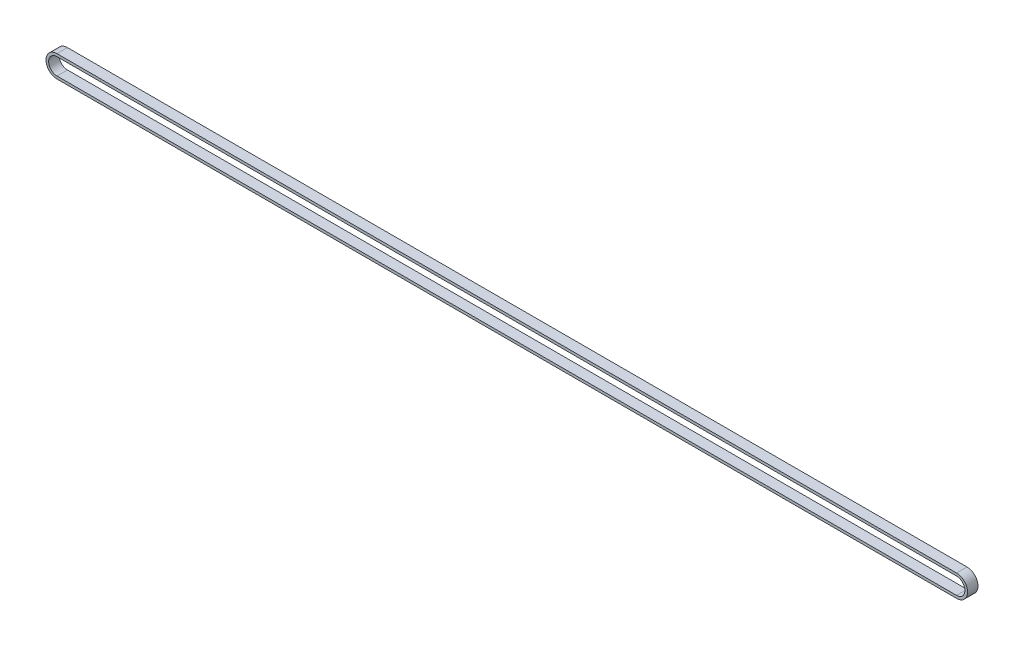
ISO-10303-21;
HEADER;
FILE_DESCRIPTION(('STEP AP214'),'2;1');
FILE_NAME('part.step','',(''),(''),'','','');
FILE_SCHEMA(('AUTOMOTIVE_DESIGN { 1 0 10303 214 1 1 1 1 }'));
ENDSEC;
DATA;
#1=APPLICATION_CONTEXT('core data for automotive mechanical design processes');
#2=APPLICATION_PROTOCOL_DEFINITION('international standard','automotive_design',2000,#1);
#3=PRODUCT_CONTEXT('',#1,'mechanical');
#4=PRODUCT('Part','Part','',(#3));
#5=PRODUCT_RELATED_PRODUCT_CATEGORY('part','',(#4));
#6=PRODUCT_DEFINITION_FORMATION('','',#4);
#7=PRODUCT_DEFINITION_CONTEXT('part definition',#1,'design');
#8=PRODUCT_DEFINITION('design','',#6,#7);
#9=PRODUCT_DEFINITION_SHAPE('','',#8);
#10=(LENGTH_UNIT() NAMED_UNIT(*) SI_UNIT(.MILLI.,.METRE.));
#11=(NAMED_UNIT(*) PLANE_ANGLE_UNIT() SI_UNIT($,.RADIAN.));
#12=(NAMED_UNIT(*) SI_UNIT($,.STERADIAN.) SOLID_ANGLE_UNIT());
#13=UNCERTAINTY_MEASURE_WITH_UNIT(LENGTH_MEASURE(1.E-05),#10,'distance_accuracy_value','');
#14=(GEOMETRIC_REPRESENTATION_CONTEXT(3) GLOBAL_UNCERTAINTY_ASSIGNED_CONTEXT((#13)) GLOBAL_UNIT_ASSIGNED_CONTEXT((#10,
#11,#12)) REPRESENTATION_CONTEXT('',''));
#15=CARTESIAN_POINT('',(0.,0.,0.));
#16=DIRECTION('',(0.,0.,1.));
#17=DIRECTION('',(1.,0.,0.));
#18=AXIS2_PLACEMENT_3D('',#15,#16,#17);
#19=CARTESIAN_POINT('',(-257.75,-6.06428571428575,6.));
#20=DIRECTION('',(0.,0.,1.));
#21=DIRECTION('',(1.,0.,0.));
#22=AXIS2_PLACEMENT_3D('',#19,#20,#21);
#23=PLANE('',#22);
#24=CARTESIAN_POINT('',(-257.75,-6.06428571428575,6.));
#25=DIRECTION('',(0.,0.,1.));
#26=DIRECTION('',(1.,0.,0.));
#27=AXIS2_PLACEMENT_3D('',#24,#25,#26);
#28=CIRCLE('',#27,6.3);
#29=CARTESIAN_POINT('',(-257.75,0.235714285714248,6.));
#30=VERTEX_POINT('',#29);
#31=CARTESIAN_POINT('',(-257.75,-12.3642857142858,6.));
#32=VERTEX_POINT('',#31);
#33=EDGE_CURVE('E134',#30,#32,#28,.T.);
#34=ORIENTED_EDGE('',*,*,#33,.T.);
#35=DIRECTION('',(1.,0.,0.));
#36=VECTOR('',#35,1.);
#37=CARTESIAN_POINT('',(-257.75,-12.3642857142858,6.));
#38=LINE('',#37,#36);
#39=CARTESIAN_POINT('',(257.75,-12.3642857142858,6.));
#40=VERTEX_POINT('',#39);
#41=EDGE_CURVE('E137',#32,#40,#38,.T.);
#42=ORIENTED_EDGE('',*,*,#41,.T.);
#43=CARTESIAN_POINT('',(257.75,-6.06428571428575,6.));
#44=DIRECTION('',(0.,0.,1.));
#45=DIRECTION('',(1.,0.,0.));
#46=AXIS2_PLACEMENT_3D('',#43,#44,#45);
#47=CIRCLE('',#46,6.3);
#48=CARTESIAN_POINT('',(257.75,0.235714285714248,6.));
#49=VERTEX_POINT('',#48);
#50=EDGE_CURVE('E140',#40,#49,#47,.T.);
#51=ORIENTED_EDGE('',*,*,#50,.T.);
#52=DIRECTION('',(-1.,0.,0.));
#53=VECTOR('',#52,1.);
#54=CARTESIAN_POINT('',(-257.75,0.235714285714248,6.));
#55=LINE('',#54,#53);
#56=EDGE_CURVE('E142',#49,#30,#55,.T.);
#57=ORIENTED_EDGE('',*,*,#56,.T.);
#58=EDGE_LOOP('',(#34,#42,#51,#57));
#59=FACE_BOUND('',#58,.T.);
#60=DIRECTION('',(-1.,0.,0.));
#61=VECTOR('',#60,1.);
#62=CARTESIAN_POINT('',(-257.75,-1.26428571428575,6.));
#63=LINE('',#62,#61);
#64=CARTESIAN_POINT('',(257.75,-1.26428571428575,6.));
#65=VERTEX_POINT('',#64);
#66=CARTESIAN_POINT('',(-257.75,-1.26428571428575,6.));
#67=VERTEX_POINT('',#66);
#68=EDGE_CURVE('E106',#65,#67,#63,.T.);
#69=ORIENTED_EDGE('',*,*,#68,.F.);
#70=CARTESIAN_POINT('',(257.75,-6.06428571428575,6.));
#71=DIRECTION('',(0.,0.,1.));
#72=DIRECTION('',(1.,0.,0.));
#73=AXIS2_PLACEMENT_3D('',#70,#71,#72);
#74=CIRCLE('',#73,4.8);
#75=CARTESIAN_POINT('',(257.75,-10.8642857142858,6.));
#76=VERTEX_POINT('',#75);
#77=EDGE_CURVE('E98',#76,#65,#74,.T.);
#78=ORIENTED_EDGE('',*,*,#77,.F.);
#79=DIRECTION('',(1.,0.,0.));
#80=VECTOR('',#79,1.);
#81=CARTESIAN_POINT('',(-257.75,-10.8642857142858,6.));
#82=LINE('',#81,#80);
#83=CARTESIAN_POINT('',(-257.75,-10.8642857142858,6.));
#84=VERTEX_POINT('',#83);
#85=EDGE_CURVE('E120',#84,#76,#82,.T.);
#86=ORIENTED_EDGE('',*,*,#85,.F.);
#87=CARTESIAN_POINT('',(-257.75,-6.06428571428575,6.));
#88=DIRECTION('',(0.,0.,1.));
#89=DIRECTION('',(1.,0.,0.));
#90=AXIS2_PLACEMENT_3D('',#87,#88,#89);
#91=CIRCLE('',#90,4.8);
#92=EDGE_CURVE('E118',#67,#84,#91,.T.);
#93=ORIENTED_EDGE('',*,*,#92,.F.);
#94=EDGE_LOOP('',(#69,#78,#86,#93));
#95=FACE_BOUND('',#94,.T.);
#96=ADVANCED_FACE('F33',(#59,#95),#23,.T.);
#97=CARTESIAN_POINT('',(-257.75,-6.06428571428575,0.));
#98=DIRECTION('',(0.,0.,1.));
#99=DIRECTION('',(1.,0.,0.));
#100=AXIS2_PLACEMENT_3D('',#97,#98,#99);
#101=PLANE('',#100);
#102=CARTESIAN_POINT('',(-257.75,-6.06428571428575,0.));
#103=DIRECTION('',(0.,0.,1.));
#104=DIRECTION('',(1.,0.,0.));
#105=AXIS2_PLACEMENT_3D('',#102,#103,#104);
#106=CIRCLE('',#105,6.3);
#107=CARTESIAN_POINT('',(-257.75,0.235714285714248,0.));
#108=VERTEX_POINT('',#107);
#109=CARTESIAN_POINT('',(-257.75,-12.3642857142858,0.));
#110=VERTEX_POINT('',#109);
#111=EDGE_CURVE('E114',#108,#110,#106,.T.);
#112=ORIENTED_EDGE('',*,*,#111,.F.);
#113=DIRECTION('',(-1.,0.,0.));
#114=VECTOR('',#113,1.);
#115=CARTESIAN_POINT('',(-257.75,0.235714285714248,0.));
#116=LINE('',#115,#114);
#117=CARTESIAN_POINT('',(257.75,0.235714285714248,0.));
#118=VERTEX_POINT('',#117);
#119=EDGE_CURVE('E138',#118,#108,#116,.T.);
#120=ORIENTED_EDGE('',*,*,#119,.F.);
#121=CARTESIAN_POINT('',(257.75,-6.06428571428575,0.));
#122=DIRECTION('',(0.,0.,1.));
#123=DIRECTION('',(1.,0.,0.));
#124=AXIS2_PLACEMENT_3D('',#121,#122,#123);
#125=CIRCLE('',#124,6.3);
#126=CARTESIAN_POINT('',(257.75,-12.3642857142858,0.));
#127=VERTEX_POINT('',#126);
#128=EDGE_CURVE('E149',#127,#118,#125,.T.);
#129=ORIENTED_EDGE('',*,*,#128,.F.);
#130=DIRECTION('',(1.,0.,0.));
#131=VECTOR('',#130,1.);
#132=CARTESIAN_POINT('',(-257.75,-12.3642857142858,0.));
#133=LINE('',#132,#131);
#134=EDGE_CURVE('E147',#110,#127,#133,.T.);
#135=ORIENTED_EDGE('',*,*,#134,.F.);
#136=EDGE_LOOP('',(#112,#120,#129,#135));
#137=FACE_BOUND('',#136,.T.);
#138=CARTESIAN_POINT('',(257.75,-6.06428571428575,0.));
#139=DIRECTION('',(0.,0.,1.));
#140=DIRECTION('',(1.,0.,0.));
#141=AXIS2_PLACEMENT_3D('',#138,#139,#140);
#142=CIRCLE('',#141,4.8);
#143=CARTESIAN_POINT('',(257.75,-10.8642857142858,0.));
#144=VERTEX_POINT('',#143);
#145=CARTESIAN_POINT('',(257.75,-1.26428571428575,0.));
#146=VERTEX_POINT('',#145);
#147=EDGE_CURVE('E56',#144,#146,#142,.T.);
#148=ORIENTED_EDGE('',*,*,#147,.T.);
#149=DIRECTION('',(-1.,0.,0.));
#150=VECTOR('',#149,1.);
#151=CARTESIAN_POINT('',(-257.75,-1.26428571428575,0.));
#152=LINE('',#151,#150);
#153=CARTESIAN_POINT('',(-257.75,-1.26428571428575,0.));
#154=VERTEX_POINT('',#153);
#155=EDGE_CURVE('E113',#146,#154,#152,.T.);
#156=ORIENTED_EDGE('',*,*,#155,.T.);
#157=CARTESIAN_POINT('',(-257.75,-6.06428571428575,0.));
#158=DIRECTION('',(0.,0.,1.));
#159=DIRECTION('',(1.,0.,0.));
#160=AXIS2_PLACEMENT_3D('',#157,#158,#159);
#161=CIRCLE('',#160,4.8);
#162=CARTESIAN_POINT('',(-257.75,-10.8642857142858,0.));
#163=VERTEX_POINT('',#162);
#164=EDGE_CURVE('E126',#154,#163,#161,.T.);
#165=ORIENTED_EDGE('',*,*,#164,.T.);
#166=DIRECTION('',(1.,0.,0.));
#167=VECTOR('',#166,1.);
#168=CARTESIAN_POINT('',(-257.75,-10.8642857142858,0.));
#169=LINE('',#168,#167);
#170=EDGE_CURVE('E107',#163,#144,#169,.T.);
#171=ORIENTED_EDGE('',*,*,#170,.T.);
#172=EDGE_LOOP('',(#148,#156,#165,#171));
#173=FACE_BOUND('',#172,.T.);
#174=ADVANCED_FACE('F167',(#137,#173),#101,.F.);
#175=CARTESIAN_POINT('',(-257.75,-6.06428571428575,6.));
#176=DIRECTION('',(0.,0.,-1.));
#177=DIRECTION('',(-1.,0.,0.));
#178=AXIS2_PLACEMENT_3D('',#175,#176,#177);
#179=CYLINDRICAL_SURFACE('',#178,6.3);
#180=ORIENTED_EDGE('',*,*,#111,.T.);
#181=DIRECTION('',(0.,0.,-1.));
#182=VECTOR('',#181,1.);
#183=CARTESIAN_POINT('',(-257.75,-12.3642857142858,6.));
#184=LINE('',#183,#182);
#185=EDGE_CURVE('E11',#32,#110,#184,.T.);
#186=ORIENTED_EDGE('',*,*,#185,.F.);
#187=ORIENTED_EDGE('',*,*,#33,.F.);
#188=DIRECTION('',(0.,0.,-1.));
#189=VECTOR('',#188,1.);
#190=CARTESIAN_POINT('',(-257.75,0.235714285714248,6.));
#191=LINE('',#190,#189);
#192=EDGE_CURVE('E144',#30,#108,#191,.T.);
#193=ORIENTED_EDGE('',*,*,#192,.T.);
#194=EDGE_LOOP('',(#180,#186,#187,#193));
#195=FACE_BOUND('',#194,.T.);
#196=ADVANCED_FACE('F35',(#195),#179,.T.);
#197=CARTESIAN_POINT('',(-257.75,-12.3642857142858,6.));
#198=DIRECTION('',(0.,1.,0.));
#199=DIRECTION('',(0.,0.,1.));
#200=AXIS2_PLACEMENT_3D('',#197,#198,#199);
#201=PLANE('',#200);
#202=ORIENTED_EDGE('',*,*,#134,.T.);
#203=DIRECTION('',(0.,0.,-1.));
#204=VECTOR('',#203,1.);
#205=CARTESIAN_POINT('',(257.75,-12.3642857142858,6.));
#206=LINE('',#205,#204);
#207=EDGE_CURVE('E41',#40,#127,#206,.T.);
#208=ORIENTED_EDGE('',*,*,#207,.F.);
#209=ORIENTED_EDGE('',*,*,#41,.F.);
#210=ORIENTED_EDGE('',*,*,#185,.T.);
#211=EDGE_LOOP('',(#202,#208,#209,#210));
#212=FACE_BOUND('',#211,.T.);
#213=ADVANCED_FACE('F177',(#212),#201,.F.);
#214=CARTESIAN_POINT('',(257.75,-6.06428571428575,6.));
#215=DIRECTION('',(0.,0.,-1.));
#216=DIRECTION('',(-1.,0.,0.));
#217=AXIS2_PLACEMENT_3D('',#214,#215,#216);
#218=CYLINDRICAL_SURFACE('',#217,6.3);
#219=ORIENTED_EDGE('',*,*,#128,.T.);
#220=DIRECTION('',(0.,0.,-1.));
#221=VECTOR('',#220,1.);
#222=CARTESIAN_POINT('',(257.75,0.235714285714248,6.));
#223=LINE('',#222,#221);
#224=EDGE_CURVE('E154',#49,#118,#223,.T.);
#225=ORIENTED_EDGE('',*,*,#224,.F.);
#226=ORIENTED_EDGE('',*,*,#50,.F.);
#227=ORIENTED_EDGE('',*,*,#207,.T.);
#228=EDGE_LOOP('',(#219,#225,#226,#227));
#229=FACE_BOUND('',#228,.T.);
#230=ADVANCED_FACE('F161',(#229),#218,.T.);
#231=CARTESIAN_POINT('',(-257.75,0.235714285714248,6.));
#232=DIRECTION('',(0.,-1.,0.));
#233=DIRECTION('',(0.,0.,-1.));
#234=AXIS2_PLACEMENT_3D('',#231,#232,#233);
#235=PLANE('',#234);
#236=ORIENTED_EDGE('',*,*,#119,.T.);
#237=ORIENTED_EDGE('',*,*,#192,.F.);
#238=ORIENTED_EDGE('',*,*,#56,.F.);
#239=ORIENTED_EDGE('',*,*,#224,.T.);
#240=EDGE_LOOP('',(#236,#237,#238,#239));
#241=FACE_BOUND('',#240,.T.);
#242=ADVANCED_FACE('F171',(#241),#235,.F.);
#243=CARTESIAN_POINT('',(257.75,-6.06428571428575,6.));
#244=DIRECTION('',(0.,0.,-1.));
#245=DIRECTION('',(-1.,0.,0.));
#246=AXIS2_PLACEMENT_3D('',#243,#244,#245);
#247=CYLINDRICAL_SURFACE('',#246,4.8);
#248=ORIENTED_EDGE('',*,*,#147,.F.);
#249=DIRECTION('',(0.,0.,-1.));
#250=VECTOR('',#249,1.);
#251=CARTESIAN_POINT('',(257.75,-10.8642857142858,6.));
#252=LINE('',#251,#250);
#253=EDGE_CURVE('E102',#76,#144,#252,.T.);
#254=ORIENTED_EDGE('',*,*,#253,.F.);
#255=ORIENTED_EDGE('',*,*,#77,.T.);
#256=DIRECTION('',(0.,0.,-1.));
#257=VECTOR('',#256,1.);
#258=CARTESIAN_POINT('',(257.75,-1.26428571428575,6.));
#259=LINE('',#258,#257);
#260=EDGE_CURVE('E101',#65,#146,#259,.T.);
#261=ORIENTED_EDGE('',*,*,#260,.T.);
#262=EDGE_LOOP('',(#248,#254,#255,#261));
#263=FACE_BOUND('',#262,.T.);
#264=ADVANCED_FACE('F100',(#263),#247,.F.);
#265=CARTESIAN_POINT('',(-257.75,-1.26428571428575,6.));
#266=DIRECTION('',(0.,-1.,0.));
#267=DIRECTION('',(1.,0.,0.));
#268=AXIS2_PLACEMENT_3D('',#265,#266,#267);
#269=PLANE('',#268);
#270=ORIENTED_EDGE('',*,*,#155,.F.);
#271=ORIENTED_EDGE('',*,*,#260,.F.);
#272=ORIENTED_EDGE('',*,*,#68,.T.);
#273=DIRECTION('',(0.,0.,-1.));
#274=VECTOR('',#273,1.);
#275=CARTESIAN_POINT('',(-257.75,-1.26428571428575,6.));
#276=LINE('',#275,#274);
#277=EDGE_CURVE('E115',#67,#154,#276,.T.);
#278=ORIENTED_EDGE('',*,*,#277,.T.);
#279=EDGE_LOOP('',(#270,#271,#272,#278));
#280=FACE_BOUND('',#279,.T.);
#281=ADVANCED_FACE('F110',(#280),#269,.T.);
#282=CARTESIAN_POINT('',(-257.75,-6.06428571428575,6.));
#283=DIRECTION('',(0.,0.,-1.));
#284=DIRECTION('',(-1.,0.,0.));
#285=AXIS2_PLACEMENT_3D('',#282,#283,#284);
#286=CYLINDRICAL_SURFACE('',#285,4.8);
#287=ORIENTED_EDGE('',*,*,#164,.F.);
#288=ORIENTED_EDGE('',*,*,#277,.F.);
#289=ORIENTED_EDGE('',*,*,#92,.T.);
#290=DIRECTION('',(0.,0.,-1.));
#291=VECTOR('',#290,1.);
#292=CARTESIAN_POINT('',(-257.75,-10.8642857142858,6.));
#293=LINE('',#292,#291);
#294=EDGE_CURVE('E48',#84,#163,#293,.T.);
#295=ORIENTED_EDGE('',*,*,#294,.T.);
#296=EDGE_LOOP('',(#287,#288,#289,#295));
#297=FACE_BOUND('',#296,.T.);
#298=ADVANCED_FACE('F200',(#297),#286,.F.);
#299=CARTESIAN_POINT('',(-257.75,-10.8642857142858,6.));
#300=DIRECTION('',(0.,1.,0.));
#301=DIRECTION('',(-1.,0.,0.));
#302=AXIS2_PLACEMENT_3D('',#299,#300,#301);
#303=PLANE('',#302);
#304=ORIENTED_EDGE('',*,*,#170,.F.);
#305=ORIENTED_EDGE('',*,*,#294,.F.);
#306=ORIENTED_EDGE('',*,*,#85,.T.);
#307=ORIENTED_EDGE('',*,*,#253,.T.);
#308=EDGE_LOOP('',(#304,#305,#306,#307));
#309=FACE_BOUND('',#308,.T.);
#310=ADVANCED_FACE('F204',(#309),#303,.T.);
#311=CLOSED_SHELL('',(#96,#174,#196,#213,#230,#242,#264,#281,#298,#310));
#312=MANIFOLD_SOLID_BREP('B2',#311);
#313=ADVANCED_BREP_SHAPE_REPRESENTATION('',(#18,#312),#14);
#314=SHAPE_DEFINITION_REPRESENTATION(#9,#313);
ENDSEC;
END-ISO-10303-21;
